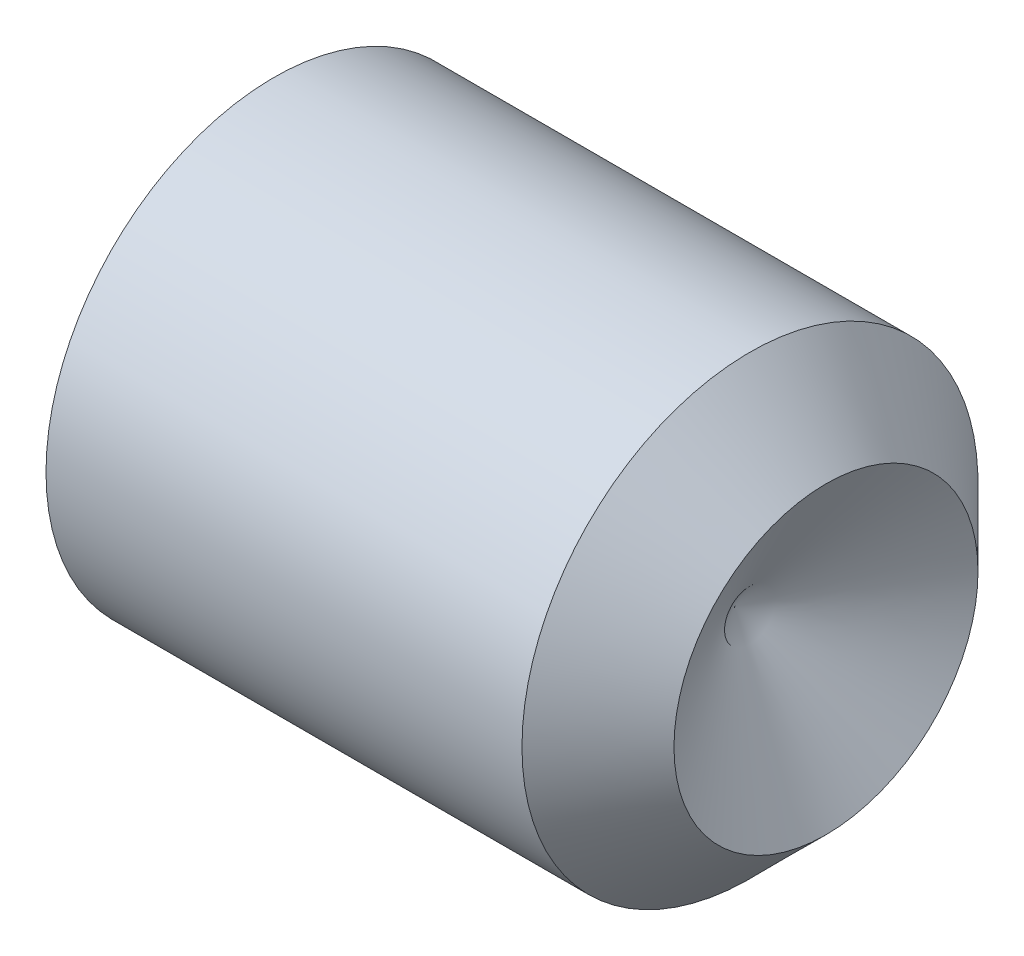
ISO-10303-21;
HEADER;
FILE_DESCRIPTION(('STEP AP214'),'2;1');
FILE_NAME('part.step','',(''),(''),'','','');
FILE_SCHEMA(('AUTOMOTIVE_DESIGN { 1 0 10303 214 1 1 1 1 }'));
ENDSEC;
DATA;
#1=APPLICATION_CONTEXT('core data for automotive mechanical design processes');
#2=APPLICATION_PROTOCOL_DEFINITION('international standard','automotive_design',2000,#1);
#3=PRODUCT_CONTEXT('',#1,'mechanical');
#4=PRODUCT('Part','Part','',(#3));
#5=PRODUCT_RELATED_PRODUCT_CATEGORY('part','',(#4));
#6=PRODUCT_DEFINITION_FORMATION('','',#4);
#7=PRODUCT_DEFINITION_CONTEXT('part definition',#1,'design');
#8=PRODUCT_DEFINITION('design','',#6,#7);
#9=PRODUCT_DEFINITION_SHAPE('','',#8);
#10=(LENGTH_UNIT() NAMED_UNIT(*) SI_UNIT(.MILLI.,.METRE.));
#11=(NAMED_UNIT(*) PLANE_ANGLE_UNIT() SI_UNIT($,.RADIAN.));
#12=(NAMED_UNIT(*) SI_UNIT($,.STERADIAN.) SOLID_ANGLE_UNIT());
#13=UNCERTAINTY_MEASURE_WITH_UNIT(LENGTH_MEASURE(1.E-05),#10,'distance_accuracy_value','');
#14=(GEOMETRIC_REPRESENTATION_CONTEXT(3) GLOBAL_UNCERTAINTY_ASSIGNED_CONTEXT((#13)) GLOBAL_UNIT_ASSIGNED_CONTEXT((#10,
#11,#12)) REPRESENTATION_CONTEXT('',''));
#15=CARTESIAN_POINT('',(0.,0.,0.));
#16=DIRECTION('',(0.,0.,1.));
#17=DIRECTION('',(1.,0.,0.));
#18=AXIS2_PLACEMENT_3D('',#15,#16,#17);
#19=CARTESIAN_POINT('',(0.,0.,0.));
#20=DIRECTION('',(-1.,0.,0.));
#21=DIRECTION('',(0.,0.,1.));
#22=AXIS2_PLACEMENT_3D('',#19,#20,#21);
#23=PLANE('',#22);
#24=CARTESIAN_POINT('',(1.13686837721616E-10,0.,0.));
#25=DIRECTION('',(-1.,0.,0.));
#26=DIRECTION('',(0.,0.,1.));
#27=AXIS2_PLACEMENT_3D('',#24,#25,#26);
#28=CIRCLE('',#27,7.671);
#29=CARTESIAN_POINT('',(1.13686837721616E-10,-4.04156163375787,6.5199709018167));
#30=VERTEX_POINT('',#29);
#31=CARTESIAN_POINT('',(1.13686837721616E-10,4.04156163375787,6.5199709018167));
#32=VERTEX_POINT('',#31);
#33=EDGE_CURVE('E253',#30,#32,#28,.T.);
#34=ORIENTED_EDGE('',*,*,#33,.F.);
#35=DIRECTION('',(0.,-0.707106781186547,0.707106781186548));
#36=VECTOR('',#35,1.);
#37=CARTESIAN_POINT('',(1.13686837721616E-10,-3.33188715295102,5.81029642100986));
#38=LINE('',#37,#36);
#39=CARTESIAN_POINT('',(1.13686837721616E-10,-3.33188715295102,5.81029642100986));
#40=VERTEX_POINT('',#39);
#41=EDGE_CURVE('E231',#40,#30,#38,.T.);
#42=ORIENTED_EDGE('',*,*,#41,.F.);
#43=DIRECTION('',(0.,0.707106781186547,0.707106781186548));
#44=VECTOR('',#43,1.);
#45=CARTESIAN_POINT('',(1.13686837721616E-10,-3.33188715295102,5.81029642100986));
#46=LINE('',#45,#44);
#47=CARTESIAN_POINT('',(1.13686837721616E-10,-5.81029642100987,3.331887152951));
#48=VERTEX_POINT('',#47);
#49=EDGE_CURVE('E245',#48,#40,#46,.T.);
#50=ORIENTED_EDGE('',*,*,#49,.F.);
#51=DIRECTION('',(0.,0.707106781186548,-0.707106781186547));
#52=VECTOR('',#51,1.);
#53=CARTESIAN_POINT('',(1.13686837721616E-10,-5.81029642100987,3.331887152951));
#54=LINE('',#53,#52);
#55=CARTESIAN_POINT('',(1.13686837721616E-10,-6.51997090181671,4.04156163375785));
#56=VERTEX_POINT('',#55);
#57=EDGE_CURVE('E242',#56,#48,#54,.T.);
#58=ORIENTED_EDGE('',*,*,#57,.F.);
#59=CARTESIAN_POINT('',(1.13686837721616E-10,0.,0.));
#60=DIRECTION('',(-1.,0.,0.));
#61=DIRECTION('',(0.,-1.,0.));
#62=AXIS2_PLACEMENT_3D('',#59,#60,#61);
#63=CIRCLE('',#62,7.671);
#64=CARTESIAN_POINT('',(1.13686837721616E-10,-6.51997090181669,-4.04156163375789));
#65=VERTEX_POINT('',#64);
#66=EDGE_CURVE('E221',#65,#56,#63,.T.);
#67=ORIENTED_EDGE('',*,*,#66,.F.);
#68=DIRECTION('',(0.,-0.707106781186545,-0.70710678118655));
#69=VECTOR('',#68,1.);
#70=CARTESIAN_POINT('',(1.13686837721616E-10,-5.81029642100984,-3.33188715295104));
#71=LINE('',#70,#69);
#72=CARTESIAN_POINT('',(1.13686837721616E-10,-5.81029642100984,-3.33188715295104));
#73=VERTEX_POINT('',#72);
#74=EDGE_CURVE('E199',#73,#65,#71,.T.);
#75=ORIENTED_EDGE('',*,*,#74,.F.);
#76=DIRECTION('',(0.,-0.707106781186551,0.707106781186544));
#77=VECTOR('',#76,1.);
#78=CARTESIAN_POINT('',(1.13686837721616E-10,-5.81029642100984,-3.33188715295104));
#79=LINE('',#78,#77);
#80=CARTESIAN_POINT('',(1.13686837721616E-10,-3.33188715295098,-5.81029642100988));
#81=VERTEX_POINT('',#80);
#82=EDGE_CURVE('E214',#81,#73,#79,.T.);
#83=ORIENTED_EDGE('',*,*,#82,.F.);
#84=DIRECTION('',(0.,0.707106781186544,0.707106781186551));
#85=VECTOR('',#84,1.);
#86=CARTESIAN_POINT('',(1.13686837721616E-10,-3.33188715295098,-5.81029642100988));
#87=LINE('',#86,#85);
#88=CARTESIAN_POINT('',(1.13686837721616E-10,-4.04156163375782,-6.51997090181672));
#89=VERTEX_POINT('',#88);
#90=EDGE_CURVE('E211',#89,#81,#87,.T.);
#91=ORIENTED_EDGE('',*,*,#90,.F.);
#92=CARTESIAN_POINT('',(1.13686837721616E-10,0.,0.));
#93=DIRECTION('',(-1.,0.,0.));
#94=DIRECTION('',(0.,0.,-1.));
#95=AXIS2_PLACEMENT_3D('',#92,#93,#94);
#96=CIRCLE('',#95,7.671);
#97=CARTESIAN_POINT('',(1.13686837721616E-10,4.04156163375791,-6.51997090181667));
#98=VERTEX_POINT('',#97);
#99=EDGE_CURVE('E191',#98,#89,#96,.T.);
#100=ORIENTED_EDGE('',*,*,#99,.F.);
#101=DIRECTION('',(0.,0.707106781186552,-0.707106781186543));
#102=VECTOR('',#101,1.);
#103=CARTESIAN_POINT('',(1.13686837721616E-10,3.33188715295106,-5.81029642100983));
#104=LINE('',#103,#102);
#105=CARTESIAN_POINT('',(1.13686837721616E-10,3.33188715295106,-5.81029642100983));
#106=VERTEX_POINT('',#105);
#107=EDGE_CURVE('E176',#106,#98,#104,.T.);
#108=ORIENTED_EDGE('',*,*,#107,.F.);
#109=DIRECTION('',(0.,-0.707106781186542,-0.707106781186553));
#110=VECTOR('',#109,1.);
#111=CARTESIAN_POINT('',(1.13686837721616E-10,3.33188715295106,-5.81029642100983));
#112=LINE('',#111,#110);
#113=CARTESIAN_POINT('',(1.13686837721616E-10,5.81029642100989,-3.33188715295096));
#114=VERTEX_POINT('',#113);
#115=EDGE_CURVE('E180',#114,#106,#112,.T.);
#116=ORIENTED_EDGE('',*,*,#115,.F.);
#117=DIRECTION('',(0.,-0.707106781186553,0.707106781186542));
#118=VECTOR('',#117,1.);
#119=CARTESIAN_POINT('',(1.13686837721616E-10,5.81029642100989,-3.33188715295096));
#120=LINE('',#119,#118);
#121=CARTESIAN_POINT('',(1.13686837721616E-10,6.51997090181674,-4.0415616337578));
#122=VERTEX_POINT('',#121);
#123=EDGE_CURVE('E185',#122,#114,#120,.T.);
#124=ORIENTED_EDGE('',*,*,#123,.F.);
#125=CARTESIAN_POINT('',(1.13686837721616E-10,0.,0.));
#126=DIRECTION('',(-1.,0.,0.));
#127=DIRECTION('',(0.,0.,-1.));
#128=AXIS2_PLACEMENT_3D('',#125,#126,#127);
#129=CIRCLE('',#128,7.671);
#130=CARTESIAN_POINT('',(1.13686837721616E-10,6.51997090181672,4.04156163375784));
#131=VERTEX_POINT('',#130);
#132=EDGE_CURVE('E166',#131,#122,#129,.T.);
#133=ORIENTED_EDGE('',*,*,#132,.F.);
#134=DIRECTION('',(0.,0.70710678118655,0.707106781186545));
#135=VECTOR('',#134,1.);
#136=CARTESIAN_POINT('',(1.13686837721616E-10,5.81029642100987,3.331887152951));
#137=LINE('',#136,#135);
#138=CARTESIAN_POINT('',(1.13686837721616E-10,5.81029642100987,3.331887152951));
#139=VERTEX_POINT('',#138);
#140=EDGE_CURVE('E275',#139,#131,#137,.T.);
#141=ORIENTED_EDGE('',*,*,#140,.F.);
#142=DIRECTION('',(0.,0.707106781186546,-0.707106781186549));
#143=VECTOR('',#142,1.);
#144=CARTESIAN_POINT('',(1.13686837721616E-10,5.81029642100987,3.331887152951));
#145=LINE('',#144,#143);
#146=CARTESIAN_POINT('',(1.13686837721616E-10,3.33188715295102,5.81029642100985));
#147=VERTEX_POINT('',#146);
#148=EDGE_CURVE('E272',#147,#139,#145,.T.);
#149=ORIENTED_EDGE('',*,*,#148,.F.);
#150=DIRECTION('',(0.,-0.707106781186549,-0.707106781186546));
#151=VECTOR('',#150,1.);
#152=CARTESIAN_POINT('',(1.13686837721616E-10,3.33188715295102,5.81029642100985));
#153=LINE('',#152,#151);
#154=EDGE_CURVE('E269',#32,#147,#153,.T.);
#155=ORIENTED_EDGE('',*,*,#154,.F.);
#156=EDGE_LOOP('',(#34,#42,#50,#58,#67,#75,#83,#91,#100,#108,#116,#124,#133,#141,#149,#155));
#157=FACE_BOUND('',#156,.T.);
#158=CARTESIAN_POINT('',(0.,0.,0.));
#159=DIRECTION('',(-1.,0.,0.));
#160=DIRECTION('',(0.,0.,1.));
#161=AXIS2_PLACEMENT_3D('',#158,#159,#160);
#162=CIRCLE('',#161,10.352);
#163=CARTESIAN_POINT('',(0.,0.,10.352));
#164=VERTEX_POINT('',#163);
#165=EDGE_CURVE('E11',#164,#164,#162,.T.);
#166=ORIENTED_EDGE('',*,*,#165,.T.);
#167=EDGE_LOOP('',(#166));
#168=FACE_BOUND('',#167,.T.);
#169=ADVANCED_FACE('F34',(#157,#168),#23,.T.);
#170=CARTESIAN_POINT('',(0.,0.,0.));
#171=DIRECTION('',(1.,0.,0.));
#172=DIRECTION('',(0.,0.,-1.));
#173=AXIS2_PLACEMENT_3D('',#170,#171,#172);
#174=CONICAL_SURFACE('',#173,10.352,1.0471975511966);
#175=CARTESIAN_POINT('',(0.951473243624497,0.,0.));
#176=DIRECTION('',(-1.,0.,0.));
#177=DIRECTION('',(0.,0.,1.));
#178=AXIS2_PLACEMENT_3D('',#175,#176,#177);
#179=CIRCLE('',#178,12.);
#180=CARTESIAN_POINT('',(0.951473243624497,0.,12.));
#181=VERTEX_POINT('',#180);
#182=EDGE_CURVE('E41',#181,#181,#179,.T.);
#183=ORIENTED_EDGE('',*,*,#182,.T.);
#184=EDGE_LOOP('',(#183));
#185=FACE_BOUND('',#184,.T.);
#186=ORIENTED_EDGE('',*,*,#165,.F.);
#187=EDGE_LOOP('',(#186));
#188=FACE_BOUND('',#187,.T.);
#189=ADVANCED_FACE('F292',(#185,#188),#174,.T.);
#190=CARTESIAN_POINT('',(-12.7,0.,0.));
#191=DIRECTION('',(-1.,0.,0.));
#192=DIRECTION('',(0.,0.,1.));
#193=AXIS2_PLACEMENT_3D('',#190,#191,#192);
#194=CYLINDRICAL_SURFACE('',#193,12.);
#195=CARTESIAN_POINT('',(26.,0.,0.));
#196=DIRECTION('',(-1.,0.,0.));
#197=DIRECTION('',(0.,0.,1.));
#198=AXIS2_PLACEMENT_3D('',#195,#196,#197);
#199=CIRCLE('',#198,12.);
#200=CARTESIAN_POINT('',(26.,0.,12.));
#201=VERTEX_POINT('',#200);
#202=EDGE_CURVE('E287',#201,#201,#199,.T.);
#203=ORIENTED_EDGE('',*,*,#202,.T.);
#204=EDGE_LOOP('',(#203));
#205=FACE_BOUND('',#204,.T.);
#206=ORIENTED_EDGE('',*,*,#182,.F.);
#207=EDGE_LOOP('',(#206));
#208=FACE_BOUND('',#207,.T.);
#209=ADVANCED_FACE('F295',(#205,#208),#194,.T.);
#210=CARTESIAN_POINT('',(26.,0.,0.));
#211=DIRECTION('',(-1.,0.,0.));
#212=DIRECTION('',(0.,0.,1.));
#213=AXIS2_PLACEMENT_3D('',#210,#211,#212);
#214=CONICAL_SURFACE('',#213,12.,0.785398163397447);
#215=CARTESIAN_POINT('',(30.,0.,0.));
#216=DIRECTION('',(-1.,0.,0.));
#217=DIRECTION('',(0.,0.,1.));
#218=AXIS2_PLACEMENT_3D('',#215,#216,#217);
#219=CIRCLE('',#218,8.);
#220=CARTESIAN_POINT('',(30.,0.,8.));
#221=VERTEX_POINT('',#220);
#222=EDGE_CURVE('E279',#221,#221,#219,.T.);
#223=ORIENTED_EDGE('',*,*,#222,.T.);
#224=EDGE_LOOP('',(#223));
#225=FACE_BOUND('',#224,.T.);
#226=ORIENTED_EDGE('',*,*,#202,.F.);
#227=EDGE_LOOP('',(#226));
#228=FACE_BOUND('',#227,.T.);
#229=ADVANCED_FACE('F297',(#225,#228),#214,.T.);
#230=CARTESIAN_POINT('',(25.1931150477795,0.,0.));
#231=DIRECTION('',(1.,0.,0.));
#232=DIRECTION('',(0.,0.,-1.));
#233=AXIS2_PLACEMENT_3D('',#230,#231,#232);
#234=CONICAL_SURFACE('',#233,0.,1.02974425867666);
#235=ORIENTED_EDGE('',*,*,#222,.F.);
#236=EDGE_LOOP('',(#235));
#237=FACE_BOUND('',#236,.T.);
#238=CARTESIAN_POINT('',(25.1931150477795,0.,0.));
#239=VERTEX_POINT('',#238);
#240=VERTEX_LOOP('',#239);
#241=FACE_BOUND('',#240,.T.);
#242=ADVANCED_FACE('F304',(#237,#241),#234,.F.);
#243=CARTESIAN_POINT('',(12.0000000001137,0.,0.));
#244=DIRECTION('',(-1.,0.,0.));
#245=DIRECTION('',(0.,0.,1.));
#246=AXIS2_PLACEMENT_3D('',#243,#244,#245);
#247=CYLINDRICAL_SURFACE('',#246,7.671);
#248=ORIENTED_EDGE('',*,*,#132,.T.);
#249=DIRECTION('',(-1.,0.,0.));
#250=VECTOR('',#249,1.);
#251=CARTESIAN_POINT('',(12.0000000001137,6.51997090181674,-4.0415616337578));
#252=LINE('',#251,#250);
#253=CARTESIAN_POINT('',(12.0000000001137,6.51997090181674,-4.0415616337578));
#254=VERTEX_POINT('',#253);
#255=EDGE_CURVE('E163',#254,#122,#252,.T.);
#256=ORIENTED_EDGE('',*,*,#255,.F.);
#257=CARTESIAN_POINT('',(12.0000000001137,0.,0.));
#258=DIRECTION('',(-1.,0.,0.));
#259=DIRECTION('',(0.,0.,-1.));
#260=AXIS2_PLACEMENT_3D('',#257,#258,#259);
#261=CIRCLE('',#260,7.671);
#262=CARTESIAN_POINT('',(12.0000000001137,6.51997090181672,4.04156163375784));
#263=VERTEX_POINT('',#262);
#264=EDGE_CURVE('E152',#263,#254,#261,.T.);
#265=ORIENTED_EDGE('',*,*,#264,.F.);
#266=DIRECTION('',(-1.,0.,0.));
#267=VECTOR('',#266,1.);
#268=CARTESIAN_POINT('',(12.0000000001137,6.51997090181672,4.04156163375784));
#269=LINE('',#268,#267);
#270=EDGE_CURVE('E52',#263,#131,#269,.T.);
#271=ORIENTED_EDGE('',*,*,#270,.T.);
#272=EDGE_LOOP('',(#248,#256,#265,#271));
#273=FACE_BOUND('',#272,.T.);
#274=ADVANCED_FACE('F164',(#273),#247,.F.);
#275=CARTESIAN_POINT('',(12.0000000001137,5.81029642100987,3.331887152951));
#276=DIRECTION('',(0.,-0.707106781186545,0.70710678118655));
#277=DIRECTION('',(0.,-0.70710678118655,-0.707106781186545));
#278=AXIS2_PLACEMENT_3D('',#275,#276,#277);
#279=PLANE('',#278);
#280=ORIENTED_EDGE('',*,*,#140,.T.);
#281=ORIENTED_EDGE('',*,*,#270,.F.);
#282=DIRECTION('',(0.,0.70710678118655,0.707106781186545));
#283=VECTOR('',#282,1.);
#284=CARTESIAN_POINT('',(12.0000000001137,5.81029642100987,3.331887152951));
#285=LINE('',#284,#283);
#286=CARTESIAN_POINT('',(12.0000000001137,5.81029642100987,3.331887152951));
#287=VERTEX_POINT('',#286);
#288=EDGE_CURVE('E160',#287,#263,#285,.T.);
#289=ORIENTED_EDGE('',*,*,#288,.F.);
#290=DIRECTION('',(-1.,0.,0.));
#291=VECTOR('',#290,1.);
#292=CARTESIAN_POINT('',(12.0000000001137,5.81029642100987,3.331887152951));
#293=LINE('',#292,#291);
#294=EDGE_CURVE('E280',#287,#139,#293,.T.);
#295=ORIENTED_EDGE('',*,*,#294,.T.);
#296=EDGE_LOOP('',(#280,#281,#289,#295));
#297=FACE_BOUND('',#296,.T.);
#298=ADVANCED_FACE('F357',(#297),#279,.F.);
#299=CARTESIAN_POINT('',(12.0000000001137,5.81029642100987,3.331887152951));
#300=DIRECTION('',(0.,0.707106781186549,0.707106781186546));
#301=DIRECTION('',(0.,-0.707106781186546,0.707106781186549));
#302=AXIS2_PLACEMENT_3D('',#299,#300,#301);
#303=PLANE('',#302);
#304=ORIENTED_EDGE('',*,*,#148,.T.);
#305=ORIENTED_EDGE('',*,*,#294,.F.);
#306=DIRECTION('',(0.,0.707106781186546,-0.707106781186549));
#307=VECTOR('',#306,1.);
#308=CARTESIAN_POINT('',(12.0000000001137,5.81029642100987,3.331887152951));
#309=LINE('',#308,#307);
#310=CARTESIAN_POINT('',(12.0000000001137,3.33188715295102,5.81029642100985));
#311=VERTEX_POINT('',#310);
#312=EDGE_CURVE('E265',#311,#287,#309,.T.);
#313=ORIENTED_EDGE('',*,*,#312,.F.);
#314=DIRECTION('',(-1.,0.,0.));
#315=VECTOR('',#314,1.);
#316=CARTESIAN_POINT('',(12.0000000001137,3.33188715295102,5.81029642100985));
#317=LINE('',#316,#315);
#318=EDGE_CURVE('E282',#311,#147,#317,.T.);
#319=ORIENTED_EDGE('',*,*,#318,.T.);
#320=EDGE_LOOP('',(#304,#305,#313,#319));
#321=FACE_BOUND('',#320,.T.);
#322=ADVANCED_FACE('F360',(#321),#303,.F.);
#323=CARTESIAN_POINT('',(12.0000000001137,3.33188715295102,5.81029642100985));
#324=DIRECTION('',(0.,0.707106781186546,-0.707106781186549));
#325=DIRECTION('',(0.,0.707106781186549,0.707106781186546));
#326=AXIS2_PLACEMENT_3D('',#323,#324,#325);
#327=PLANE('',#326);
#328=ORIENTED_EDGE('',*,*,#154,.T.);
#329=ORIENTED_EDGE('',*,*,#318,.F.);
#330=DIRECTION('',(0.,-0.707106781186549,-0.707106781186546));
#331=VECTOR('',#330,1.);
#332=CARTESIAN_POINT('',(12.0000000001137,3.33188715295102,5.81029642100985));
#333=LINE('',#332,#331);
#334=CARTESIAN_POINT('',(12.0000000001137,4.04156163375787,6.5199709018167));
#335=VERTEX_POINT('',#334);
#336=EDGE_CURVE('E262',#335,#311,#333,.T.);
#337=ORIENTED_EDGE('',*,*,#336,.F.);
#338=DIRECTION('',(-1.,0.,0.));
#339=VECTOR('',#338,1.);
#340=CARTESIAN_POINT('',(12.0000000001137,4.04156163375787,6.5199709018167));
#341=LINE('',#340,#339);
#342=EDGE_CURVE('E78',#335,#32,#341,.T.);
#343=ORIENTED_EDGE('',*,*,#342,.T.);
#344=EDGE_LOOP('',(#328,#329,#337,#343));
#345=FACE_BOUND('',#344,.T.);
#346=ADVANCED_FACE('F362',(#345),#327,.F.);
#347=CARTESIAN_POINT('',(12.0000000001137,0.,0.));
#348=DIRECTION('',(-1.,0.,0.));
#349=DIRECTION('',(0.,0.,1.));
#350=AXIS2_PLACEMENT_3D('',#347,#348,#349);
#351=CYLINDRICAL_SURFACE('',#350,7.671);
#352=ORIENTED_EDGE('',*,*,#33,.T.);
#353=ORIENTED_EDGE('',*,*,#342,.F.);
#354=CARTESIAN_POINT('',(12.0000000001137,0.,0.));
#355=DIRECTION('',(-1.,0.,0.));
#356=DIRECTION('',(0.,0.,1.));
#357=AXIS2_PLACEMENT_3D('',#354,#355,#356);
#358=CIRCLE('',#357,7.671);
#359=CARTESIAN_POINT('',(12.0000000001137,-4.04156163375787,6.5199709018167));
#360=VERTEX_POINT('',#359);
#361=EDGE_CURVE('E259',#360,#335,#358,.T.);
#362=ORIENTED_EDGE('',*,*,#361,.F.);
#363=DIRECTION('',(-1.,0.,0.));
#364=VECTOR('',#363,1.);
#365=CARTESIAN_POINT('',(12.0000000001137,-4.04156163375787,6.5199709018167));
#366=LINE('',#365,#364);
#367=EDGE_CURVE('E250',#360,#30,#366,.T.);
#368=ORIENTED_EDGE('',*,*,#367,.T.);
#369=EDGE_LOOP('',(#352,#353,#362,#368));
#370=FACE_BOUND('',#369,.T.);
#371=ADVANCED_FACE('F318',(#370),#351,.F.);
#372=CARTESIAN_POINT('',(12.0000000001137,0.,0.));
#373=DIRECTION('',(1.,0.,0.));
#374=DIRECTION('',(0.,0.,-1.));
#375=AXIS2_PLACEMENT_3D('',#372,#373,#374);
#376=PLANE('',#375);
#377=DIRECTION('',(0.,-0.707106781186547,0.707106781186548));
#378=VECTOR('',#377,1.);
#379=CARTESIAN_POINT('',(12.0000000001137,-3.33188715295102,5.81029642100986));
#380=LINE('',#379,#378);
#381=CARTESIAN_POINT('',(12.0000000001137,-3.33188715295102,5.81029642100986));
#382=VERTEX_POINT('',#381);
#383=EDGE_CURVE('E237',#382,#360,#380,.T.);
#384=ORIENTED_EDGE('',*,*,#383,.T.);
#385=ORIENTED_EDGE('',*,*,#361,.T.);
#386=ORIENTED_EDGE('',*,*,#336,.T.);
#387=ORIENTED_EDGE('',*,*,#312,.T.);
#388=ORIENTED_EDGE('',*,*,#288,.T.);
#389=ORIENTED_EDGE('',*,*,#264,.T.);
#390=DIRECTION('',(0.,-0.707106781186553,0.707106781186542));
#391=VECTOR('',#390,1.);
#392=CARTESIAN_POINT('',(12.0000000001137,5.81029642100989,-3.33188715295096));
#393=LINE('',#392,#391);
#394=CARTESIAN_POINT('',(12.0000000001137,5.81029642100989,-3.33188715295096));
#395=VERTEX_POINT('',#394);
#396=EDGE_CURVE('E158',#254,#395,#393,.T.);
#397=ORIENTED_EDGE('',*,*,#396,.T.);
#398=DIRECTION('',(0.,-0.707106781186542,-0.707106781186553));
#399=VECTOR('',#398,1.);
#400=CARTESIAN_POINT('',(12.0000000001137,3.33188715295106,-5.81029642100983));
#401=LINE('',#400,#399);
#402=CARTESIAN_POINT('',(12.0000000001137,3.33188715295106,-5.81029642100983));
#403=VERTEX_POINT('',#402);
#404=EDGE_CURVE('E175',#395,#403,#401,.T.);
#405=ORIENTED_EDGE('',*,*,#404,.T.);
#406=DIRECTION('',(0.,0.707106781186552,-0.707106781186543));
#407=VECTOR('',#406,1.);
#408=CARTESIAN_POINT('',(12.0000000001137,3.33188715295106,-5.81029642100983));
#409=LINE('',#408,#407);
#410=CARTESIAN_POINT('',(12.0000000001137,4.04156163375791,-6.51997090181667));
#411=VERTEX_POINT('',#410);
#412=EDGE_CURVE('E171',#403,#411,#409,.T.);
#413=ORIENTED_EDGE('',*,*,#412,.T.);
#414=CARTESIAN_POINT('',(12.0000000001137,0.,0.));
#415=DIRECTION('',(-1.,0.,0.));
#416=DIRECTION('',(0.,0.,-1.));
#417=AXIS2_PLACEMENT_3D('',#414,#415,#416);
#418=CIRCLE('',#417,7.671);
#419=CARTESIAN_POINT('',(12.0000000001137,-4.04156163375782,-6.51997090181672));
#420=VERTEX_POINT('',#419);
#421=EDGE_CURVE('E195',#411,#420,#418,.T.);
#422=ORIENTED_EDGE('',*,*,#421,.T.);
#423=DIRECTION('',(0.,0.707106781186544,0.707106781186551));
#424=VECTOR('',#423,1.);
#425=CARTESIAN_POINT('',(12.0000000001137,-3.33188715295098,-5.81029642100988));
#426=LINE('',#425,#424);
#427=CARTESIAN_POINT('',(12.0000000001137,-3.33188715295098,-5.81029642100988));
#428=VERTEX_POINT('',#427);
#429=EDGE_CURVE('E198',#420,#428,#426,.T.);
#430=ORIENTED_EDGE('',*,*,#429,.T.);
#431=DIRECTION('',(0.,-0.707106781186551,0.707106781186544));
#432=VECTOR('',#431,1.);
#433=CARTESIAN_POINT('',(12.0000000001137,-5.81029642100984,-3.33188715295104));
#434=LINE('',#433,#432);
#435=CARTESIAN_POINT('',(12.0000000001137,-5.81029642100984,-3.33188715295104));
#436=VERTEX_POINT('',#435);
#437=EDGE_CURVE('E202',#428,#436,#434,.T.);
#438=ORIENTED_EDGE('',*,*,#437,.T.);
#439=DIRECTION('',(0.,-0.707106781186545,-0.70710678118655));
#440=VECTOR('',#439,1.);
#441=CARTESIAN_POINT('',(12.0000000001137,-5.81029642100984,-3.33188715295104));
#442=LINE('',#441,#440);
#443=CARTESIAN_POINT('',(12.0000000001137,-6.51997090181669,-4.04156163375789));
#444=VERTEX_POINT('',#443);
#445=EDGE_CURVE('E205',#436,#444,#442,.T.);
#446=ORIENTED_EDGE('',*,*,#445,.T.);
#447=CARTESIAN_POINT('',(12.0000000001137,0.,0.));
#448=DIRECTION('',(-1.,0.,0.));
#449=DIRECTION('',(0.,-1.,0.));
#450=AXIS2_PLACEMENT_3D('',#447,#448,#449);
#451=CIRCLE('',#450,7.671);
#452=CARTESIAN_POINT('',(12.0000000001137,-6.51997090181671,4.04156163375785));
#453=VERTEX_POINT('',#452);
#454=EDGE_CURVE('E227',#444,#453,#451,.T.);
#455=ORIENTED_EDGE('',*,*,#454,.T.);
#456=DIRECTION('',(0.,0.707106781186548,-0.707106781186547));
#457=VECTOR('',#456,1.);
#458=CARTESIAN_POINT('',(12.0000000001137,-5.81029642100987,3.331887152951));
#459=LINE('',#458,#457);
#460=CARTESIAN_POINT('',(12.0000000001137,-5.81029642100987,3.331887152951));
#461=VERTEX_POINT('',#460);
#462=EDGE_CURVE('E230',#453,#461,#459,.T.);
#463=ORIENTED_EDGE('',*,*,#462,.T.);
#464=DIRECTION('',(0.,0.707106781186547,0.707106781186548));
#465=VECTOR('',#464,1.);
#466=CARTESIAN_POINT('',(12.0000000001137,-3.33188715295102,5.81029642100986));
#467=LINE('',#466,#465);
#468=EDGE_CURVE('E234',#461,#382,#467,.T.);
#469=ORIENTED_EDGE('',*,*,#468,.T.);
#470=EDGE_LOOP('',(#384,#385,#386,#387,#388,#389,#397,#405,#413,#422,#430,#438,#446,#455,#463,#469));
#471=FACE_BOUND('',#470,.T.);
#472=ADVANCED_FACE('F155',(#471),#376,.F.);
#473=CARTESIAN_POINT('',(12.0000000001137,-3.33188715295102,5.81029642100986));
#474=DIRECTION('',(0.,-0.707106781186548,-0.707106781186547));
#475=DIRECTION('',(0.,0.707106781186547,-0.707106781186548));
#476=AXIS2_PLACEMENT_3D('',#473,#474,#475);
#477=PLANE('',#476);
#478=ORIENTED_EDGE('',*,*,#41,.T.);
#479=ORIENTED_EDGE('',*,*,#367,.F.);
#480=ORIENTED_EDGE('',*,*,#383,.F.);
#481=DIRECTION('',(-1.,0.,0.));
#482=VECTOR('',#481,1.);
#483=CARTESIAN_POINT('',(12.0000000001137,-3.33188715295102,5.81029642100986));
#484=LINE('',#483,#482);
#485=EDGE_CURVE('E254',#382,#40,#484,.T.);
#486=ORIENTED_EDGE('',*,*,#485,.T.);
#487=EDGE_LOOP('',(#478,#479,#480,#486));
#488=FACE_BOUND('',#487,.T.);
#489=ADVANCED_FACE('F321',(#488),#477,.F.);
#490=CARTESIAN_POINT('',(12.0000000001137,-3.33188715295102,5.81029642100986));
#491=DIRECTION('',(0.,-0.707106781186548,0.707106781186547));
#492=DIRECTION('',(0.,-0.707106781186547,-0.707106781186548));
#493=AXIS2_PLACEMENT_3D('',#490,#491,#492);
#494=PLANE('',#493);
#495=ORIENTED_EDGE('',*,*,#49,.T.);
#496=ORIENTED_EDGE('',*,*,#485,.F.);
#497=ORIENTED_EDGE('',*,*,#468,.F.);
#498=DIRECTION('',(-1.,0.,0.));
#499=VECTOR('',#498,1.);
#500=CARTESIAN_POINT('',(12.0000000001137,-5.81029642100987,3.331887152951));
#501=LINE('',#500,#499);
#502=EDGE_CURVE('E256',#461,#48,#501,.T.);
#503=ORIENTED_EDGE('',*,*,#502,.T.);
#504=EDGE_LOOP('',(#495,#496,#497,#503));
#505=FACE_BOUND('',#504,.T.);
#506=ADVANCED_FACE('F324',(#505),#494,.F.);
#507=CARTESIAN_POINT('',(12.0000000001137,-5.81029642100987,3.331887152951));
#508=DIRECTION('',(0.,0.707106781186547,0.707106781186548));
#509=DIRECTION('',(0.,-0.707106781186548,0.707106781186547));
#510=AXIS2_PLACEMENT_3D('',#507,#508,#509);
#511=PLANE('',#510);
#512=ORIENTED_EDGE('',*,*,#57,.T.);
#513=ORIENTED_EDGE('',*,*,#502,.F.);
#514=ORIENTED_EDGE('',*,*,#462,.F.);
#515=DIRECTION('',(-1.,0.,0.));
#516=VECTOR('',#515,1.);
#517=CARTESIAN_POINT('',(12.0000000001137,-6.51997090181671,4.04156163375785));
#518=LINE('',#517,#516);
#519=EDGE_CURVE('E239',#453,#56,#518,.T.);
#520=ORIENTED_EDGE('',*,*,#519,.T.);
#521=EDGE_LOOP('',(#512,#513,#514,#520));
#522=FACE_BOUND('',#521,.T.);
#523=ADVANCED_FACE('F329',(#522),#511,.F.);
#524=CARTESIAN_POINT('',(12.0000000001137,0.,0.));
#525=DIRECTION('',(-1.,0.,0.));
#526=DIRECTION('',(0.,0.,1.));
#527=AXIS2_PLACEMENT_3D('',#524,#525,#526);
#528=CYLINDRICAL_SURFACE('',#527,7.671);
#529=ORIENTED_EDGE('',*,*,#66,.T.);
#530=ORIENTED_EDGE('',*,*,#519,.F.);
#531=ORIENTED_EDGE('',*,*,#454,.F.);
#532=DIRECTION('',(-1.,0.,0.));
#533=VECTOR('',#532,1.);
#534=CARTESIAN_POINT('',(12.0000000001137,-6.51997090181669,-4.04156163375789));
#535=LINE('',#534,#533);
#536=EDGE_CURVE('E219',#444,#65,#535,.T.);
#537=ORIENTED_EDGE('',*,*,#536,.T.);
#538=EDGE_LOOP('',(#529,#530,#531,#537));
#539=FACE_BOUND('',#538,.T.);
#540=ADVANCED_FACE('F332',(#539),#528,.F.);
#541=CARTESIAN_POINT('',(12.0000000001137,-5.81029642100984,-3.33188715295104));
#542=DIRECTION('',(0.,0.70710678118655,-0.707106781186545));
#543=DIRECTION('',(0.,0.707106781186545,0.70710678118655));
#544=AXIS2_PLACEMENT_3D('',#541,#542,#543);
#545=PLANE('',#544);
#546=ORIENTED_EDGE('',*,*,#74,.T.);
#547=ORIENTED_EDGE('',*,*,#536,.F.);
#548=ORIENTED_EDGE('',*,*,#445,.F.);
#549=DIRECTION('',(-1.,0.,0.));
#550=VECTOR('',#549,1.);
#551=CARTESIAN_POINT('',(12.0000000001137,-5.81029642100984,-3.33188715295104));
#552=LINE('',#551,#550);
#553=EDGE_CURVE('E222',#436,#73,#552,.T.);
#554=ORIENTED_EDGE('',*,*,#553,.T.);
#555=EDGE_LOOP('',(#546,#547,#548,#554));
#556=FACE_BOUND('',#555,.T.);
#557=ADVANCED_FACE('F336',(#556),#545,.F.);
#558=CARTESIAN_POINT('',(12.0000000001137,-5.81029642100984,-3.33188715295104));
#559=DIRECTION('',(0.,-0.707106781186544,-0.707106781186551));
#560=DIRECTION('',(0.,0.707106781186551,-0.707106781186544));
#561=AXIS2_PLACEMENT_3D('',#558,#559,#560);
#562=PLANE('',#561);
#563=ORIENTED_EDGE('',*,*,#82,.T.);
#564=ORIENTED_EDGE('',*,*,#553,.F.);
#565=ORIENTED_EDGE('',*,*,#437,.F.);
#566=DIRECTION('',(-1.,0.,0.));
#567=VECTOR('',#566,1.);
#568=CARTESIAN_POINT('',(12.0000000001137,-3.33188715295098,-5.81029642100988));
#569=LINE('',#568,#567);
#570=EDGE_CURVE('E224',#428,#81,#569,.T.);
#571=ORIENTED_EDGE('',*,*,#570,.T.);
#572=EDGE_LOOP('',(#563,#564,#565,#571));
#573=FACE_BOUND('',#572,.T.);
#574=ADVANCED_FACE('F341',(#573),#562,.F.);
#575=CARTESIAN_POINT('',(12.0000000001137,-3.33188715295098,-5.81029642100988));
#576=DIRECTION('',(0.,-0.707106781186551,0.707106781186544));
#577=DIRECTION('',(0.,-0.707106781186544,-0.707106781186551));
#578=AXIS2_PLACEMENT_3D('',#575,#576,#577);
#579=PLANE('',#578);
#580=ORIENTED_EDGE('',*,*,#90,.T.);
#581=ORIENTED_EDGE('',*,*,#570,.F.);
#582=ORIENTED_EDGE('',*,*,#429,.F.);
#583=DIRECTION('',(-1.,0.,0.));
#584=VECTOR('',#583,1.);
#585=CARTESIAN_POINT('',(12.0000000001137,-4.04156163375782,-6.51997090181672));
#586=LINE('',#585,#584);
#587=EDGE_CURVE('E208',#420,#89,#586,.T.);
#588=ORIENTED_EDGE('',*,*,#587,.T.);
#589=EDGE_LOOP('',(#580,#581,#582,#588));
#590=FACE_BOUND('',#589,.T.);
#591=ADVANCED_FACE('F345',(#590),#579,.F.);
#592=CARTESIAN_POINT('',(12.0000000001137,0.,0.));
#593=DIRECTION('',(-1.,0.,0.));
#594=DIRECTION('',(0.,0.,1.));
#595=AXIS2_PLACEMENT_3D('',#592,#593,#594);
#596=CYLINDRICAL_SURFACE('',#595,7.671);
#597=ORIENTED_EDGE('',*,*,#99,.T.);
#598=ORIENTED_EDGE('',*,*,#587,.F.);
#599=ORIENTED_EDGE('',*,*,#421,.F.);
#600=DIRECTION('',(-1.,0.,0.));
#601=VECTOR('',#600,1.);
#602=CARTESIAN_POINT('',(12.0000000001137,4.04156163375791,-6.51997090181667));
#603=LINE('',#602,#601);
#604=EDGE_CURVE('E189',#411,#98,#603,.T.);
#605=ORIENTED_EDGE('',*,*,#604,.T.);
#606=EDGE_LOOP('',(#597,#598,#599,#605));
#607=FACE_BOUND('',#606,.T.);
#608=ADVANCED_FACE('F347',(#607),#596,.F.);
#609=CARTESIAN_POINT('',(12.0000000001137,3.33188715295106,-5.81029642100983));
#610=DIRECTION('',(0.,0.707106781186543,0.707106781186552));
#611=DIRECTION('',(0.,-0.707106781186552,0.707106781186543));
#612=AXIS2_PLACEMENT_3D('',#609,#610,#611);
#613=PLANE('',#612);
#614=ORIENTED_EDGE('',*,*,#107,.T.);
#615=ORIENTED_EDGE('',*,*,#604,.F.);
#616=ORIENTED_EDGE('',*,*,#412,.F.);
#617=DIRECTION('',(-1.,0.,0.));
#618=VECTOR('',#617,1.);
#619=CARTESIAN_POINT('',(12.0000000001137,3.33188715295106,-5.81029642100983));
#620=LINE('',#619,#618);
#621=EDGE_CURVE('E192',#403,#106,#620,.T.);
#622=ORIENTED_EDGE('',*,*,#621,.T.);
#623=EDGE_LOOP('',(#614,#615,#616,#622));
#624=FACE_BOUND('',#623,.T.);
#625=ADVANCED_FACE('F352',(#624),#613,.F.);
#626=CARTESIAN_POINT('',(12.0000000001137,3.33188715295106,-5.81029642100983));
#627=DIRECTION('',(0.,0.707106781186553,-0.707106781186542));
#628=DIRECTION('',(0.,0.707106781186542,0.707106781186553));
#629=AXIS2_PLACEMENT_3D('',#626,#627,#628);
#630=PLANE('',#629);
#631=ORIENTED_EDGE('',*,*,#115,.T.);
#632=ORIENTED_EDGE('',*,*,#621,.F.);
#633=ORIENTED_EDGE('',*,*,#404,.F.);
#634=DIRECTION('',(-1.,0.,0.));
#635=VECTOR('',#634,1.);
#636=CARTESIAN_POINT('',(12.0000000001137,5.81029642100989,-3.33188715295096));
#637=LINE('',#636,#635);
#638=EDGE_CURVE('E170',#395,#114,#637,.T.);
#639=ORIENTED_EDGE('',*,*,#638,.T.);
#640=EDGE_LOOP('',(#631,#632,#633,#639));
#641=FACE_BOUND('',#640,.T.);
#642=ADVANCED_FACE('F355',(#641),#630,.F.);
#643=CARTESIAN_POINT('',(12.0000000001137,5.81029642100989,-3.33188715295096));
#644=DIRECTION('',(0.,-0.707106781186542,-0.707106781186553));
#645=DIRECTION('',(0.,0.707106781186553,-0.707106781186542));
#646=AXIS2_PLACEMENT_3D('',#643,#644,#645);
#647=PLANE('',#646);
#648=ORIENTED_EDGE('',*,*,#123,.T.);
#649=ORIENTED_EDGE('',*,*,#638,.F.);
#650=ORIENTED_EDGE('',*,*,#396,.F.);
#651=ORIENTED_EDGE('',*,*,#255,.T.);
#652=EDGE_LOOP('',(#648,#649,#650,#651));
#653=FACE_BOUND('',#652,.T.);
#654=ADVANCED_FACE('F173',(#653),#647,.F.);
#655=CLOSED_SHELL('',(#169,#189,#209,#229,#242,#274,#298,#322,#346,#371,#472,#489,#506,#523,
#540,#557,#574,#591,#608,#625,#642,#654));
#656=MANIFOLD_SOLID_BREP('B2',#655);
#657=ADVANCED_BREP_SHAPE_REPRESENTATION('',(#18,#656),#14);
#658=SHAPE_DEFINITION_REPRESENTATION(#9,#657);
ENDSEC;
END-ISO-10303-21;
